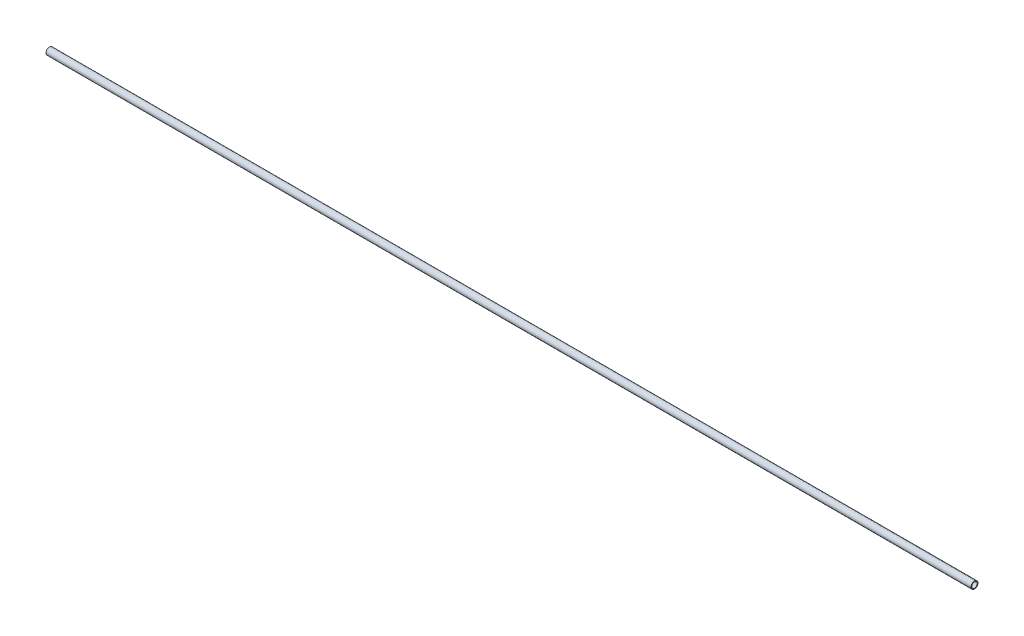
ISO-10303-21;
HEADER;
FILE_DESCRIPTION(('STEP AP214'),'2;1');
FILE_NAME('part.step','',(''),(''),'','','');
FILE_SCHEMA(('AUTOMOTIVE_DESIGN { 1 0 10303 214 1 1 1 1 }'));
ENDSEC;
DATA;
#1=APPLICATION_CONTEXT('core data for automotive mechanical design processes');
#2=APPLICATION_PROTOCOL_DEFINITION('international standard','automotive_design',2000,#1);
#3=PRODUCT_CONTEXT('',#1,'mechanical');
#4=PRODUCT('Part','Part','',(#3));
#5=PRODUCT_RELATED_PRODUCT_CATEGORY('part','',(#4));
#6=PRODUCT_DEFINITION_FORMATION('','',#4);
#7=PRODUCT_DEFINITION_CONTEXT('part definition',#1,'design');
#8=PRODUCT_DEFINITION('design','',#6,#7);
#9=PRODUCT_DEFINITION_SHAPE('','',#8);
#10=(LENGTH_UNIT() NAMED_UNIT(*) SI_UNIT(.MILLI.,.METRE.));
#11=(NAMED_UNIT(*) PLANE_ANGLE_UNIT() SI_UNIT($,.RADIAN.));
#12=(NAMED_UNIT(*) SI_UNIT($,.STERADIAN.) SOLID_ANGLE_UNIT());
#13=UNCERTAINTY_MEASURE_WITH_UNIT(LENGTH_MEASURE(1.E-05),#10,'distance_accuracy_value','');
#14=(GEOMETRIC_REPRESENTATION_CONTEXT(3) GLOBAL_UNCERTAINTY_ASSIGNED_CONTEXT((#13)) GLOBAL_UNIT_ASSIGNED_CONTEXT((#10,
#11,#12)) REPRESENTATION_CONTEXT('',''));
#15=CARTESIAN_POINT('',(0.,0.,0.));
#16=DIRECTION('',(0.,0.,1.));
#17=DIRECTION('',(1.,0.,0.));
#18=AXIS2_PLACEMENT_3D('',#15,#16,#17);
#19=CARTESIAN_POINT('',(-179.381625441696,-10.6625441696113,0.));
#20=DIRECTION('',(1.,0.,0.));
#21=DIRECTION('',(0.,0.,-1.));
#22=AXIS2_PLACEMENT_3D('',#19,#20,#21);
#23=PLANE('',#22);
#24=CARTESIAN_POINT('',(-179.381625441696,-10.6625441696113,0.));
#25=DIRECTION('',(1.,0.,0.));
#26=DIRECTION('',(0.,0.,-1.));
#27=AXIS2_PLACEMENT_3D('',#24,#25,#26);
#28=CIRCLE('',#27,8.);
#29=CARTESIAN_POINT('',(-179.381625441696,-10.6625441696113,-8.));
#30=VERTEX_POINT('',#29);
#31=EDGE_CURVE('E52',#30,#30,#28,.T.);
#32=ORIENTED_EDGE('',*,*,#31,.T.);
#33=EDGE_LOOP('',(#32));
#34=FACE_BOUND('',#33,.T.);
#35=CARTESIAN_POINT('',(-179.381625441696,-10.6625441696113,0.));
#36=DIRECTION('',(1.,0.,0.));
#37=DIRECTION('',(0.,0.,-1.));
#38=AXIS2_PLACEMENT_3D('',#35,#36,#37);
#39=CIRCLE('',#38,10.);
#40=CARTESIAN_POINT('',(-179.381625441696,-10.6625441696113,-10.));
#41=VERTEX_POINT('',#40);
#42=EDGE_CURVE('E41',#41,#41,#39,.T.);
#43=ORIENTED_EDGE('',*,*,#42,.F.);
#44=EDGE_LOOP('',(#43));
#45=FACE_BOUND('',#44,.T.);
#46=ADVANCED_FACE('F37',(#34,#45),#23,.F.);
#47=CARTESIAN_POINT('',(2480.6183745583,-10.6625441696113,0.));
#48=DIRECTION('',(1.,0.,0.));
#49=DIRECTION('',(0.,0.,-1.));
#50=AXIS2_PLACEMENT_3D('',#47,#48,#49);
#51=PLANE('',#50);
#52=CARTESIAN_POINT('',(2480.6183745583,-10.6625441696113,0.));
#53=DIRECTION('',(1.,0.,0.));
#54=DIRECTION('',(0.,0.,-1.));
#55=AXIS2_PLACEMENT_3D('',#52,#53,#54);
#56=CIRCLE('',#55,8.);
#57=CARTESIAN_POINT('',(2480.6183745583,-10.6625441696113,-8.));
#58=VERTEX_POINT('',#57);
#59=EDGE_CURVE('E48',#58,#58,#56,.T.);
#60=ORIENTED_EDGE('',*,*,#59,.F.);
#61=EDGE_LOOP('',(#60));
#62=FACE_BOUND('',#61,.T.);
#63=CARTESIAN_POINT('',(2480.6183745583,-10.6625441696113,0.));
#64=DIRECTION('',(1.,0.,0.));
#65=DIRECTION('',(0.,0.,-1.));
#66=AXIS2_PLACEMENT_3D('',#63,#64,#65);
#67=CIRCLE('',#66,10.);
#68=CARTESIAN_POINT('',(2480.6183745583,-10.6625441696113,-10.));
#69=VERTEX_POINT('',#68);
#70=EDGE_CURVE('E11',#69,#69,#67,.T.);
#71=ORIENTED_EDGE('',*,*,#70,.T.);
#72=EDGE_LOOP('',(#71));
#73=FACE_BOUND('',#72,.T.);
#74=ADVANCED_FACE('F65',(#62,#73),#51,.T.);
#75=CARTESIAN_POINT('',(-179.381625441696,-10.6625441696113,0.));
#76=DIRECTION('',(1.,0.,0.));
#77=DIRECTION('',(0.,0.,-1.));
#78=AXIS2_PLACEMENT_3D('',#75,#76,#77);
#79=CYLINDRICAL_SURFACE('',#78,10.);
#80=ORIENTED_EDGE('',*,*,#70,.F.);
#81=EDGE_LOOP('',(#80));
#82=FACE_BOUND('',#81,.T.);
#83=ORIENTED_EDGE('',*,*,#42,.T.);
#84=EDGE_LOOP('',(#83));
#85=FACE_BOUND('',#84,.T.);
#86=ADVANCED_FACE('F39',(#82,#85),#79,.T.);
#87=CARTESIAN_POINT('',(-179.381625441696,-10.6625441696113,0.));
#88=DIRECTION('',(1.,0.,0.));
#89=DIRECTION('',(0.,0.,-1.));
#90=AXIS2_PLACEMENT_3D('',#87,#88,#89);
#91=CYLINDRICAL_SURFACE('',#90,8.);
#92=ORIENTED_EDGE('',*,*,#59,.T.);
#93=EDGE_LOOP('',(#92));
#94=FACE_BOUND('',#93,.T.);
#95=ORIENTED_EDGE('',*,*,#31,.F.);
#96=EDGE_LOOP('',(#95));
#97=FACE_BOUND('',#96,.T.);
#98=ADVANCED_FACE('F58',(#94,#97),#91,.F.);
#99=CLOSED_SHELL('',(#46,#74,#86,#98));
#100=MANIFOLD_SOLID_BREP('B2',#99);
#101=ADVANCED_BREP_SHAPE_REPRESENTATION('',(#18,#100),#14);
#102=SHAPE_DEFINITION_REPRESENTATION(#9,#101);
ENDSEC;
END-ISO-10303-21;
